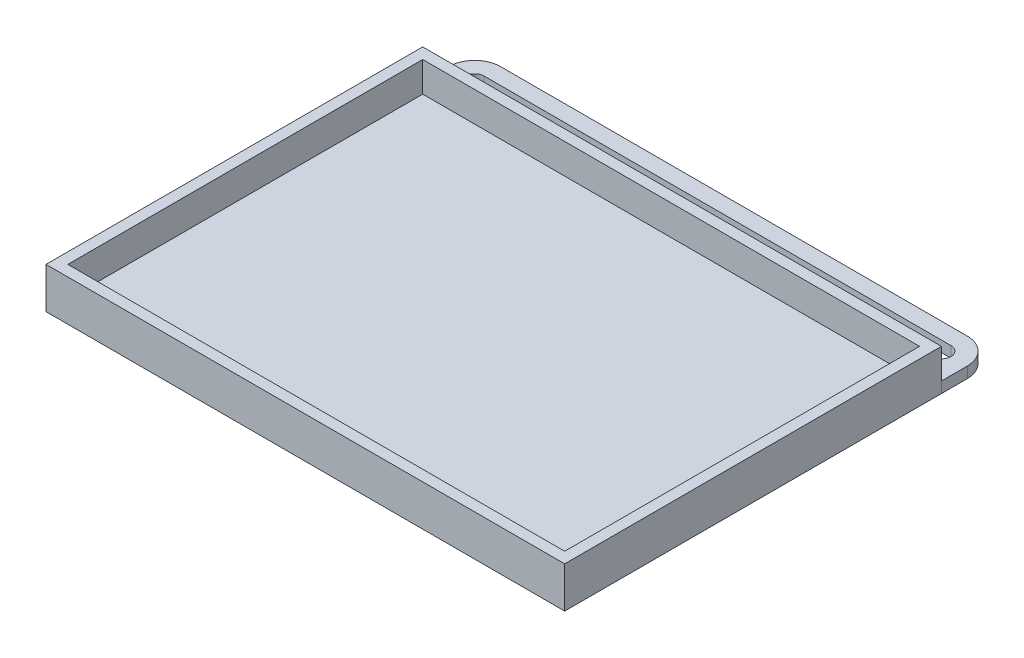
ISO-10303-21;
HEADER;
FILE_DESCRIPTION(('STEP AP214'),'2;1');
FILE_NAME('part.step','',(''),(''),'','','');
FILE_SCHEMA(('AUTOMOTIVE_DESIGN { 1 0 10303 214 1 1 1 1 }'));
ENDSEC;
DATA;
#1=APPLICATION_CONTEXT('core data for automotive mechanical design processes');
#2=APPLICATION_PROTOCOL_DEFINITION('international standard','automotive_design',2000,#1);
#3=PRODUCT_CONTEXT('',#1,'mechanical');
#4=PRODUCT('Part','Part','',(#3));
#5=PRODUCT_RELATED_PRODUCT_CATEGORY('part','',(#4));
#6=PRODUCT_DEFINITION_FORMATION('','',#4);
#7=PRODUCT_DEFINITION_CONTEXT('part definition',#1,'design');
#8=PRODUCT_DEFINITION('design','',#6,#7);
#9=PRODUCT_DEFINITION_SHAPE('','',#8);
#10=(LENGTH_UNIT() NAMED_UNIT(*) SI_UNIT(.MILLI.,.METRE.));
#11=(NAMED_UNIT(*) PLANE_ANGLE_UNIT() SI_UNIT($,.RADIAN.));
#12=(NAMED_UNIT(*) SI_UNIT($,.STERADIAN.) SOLID_ANGLE_UNIT());
#13=UNCERTAINTY_MEASURE_WITH_UNIT(LENGTH_MEASURE(1.E-05),#10,'distance_accuracy_value','');
#14=(GEOMETRIC_REPRESENTATION_CONTEXT(3) GLOBAL_UNCERTAINTY_ASSIGNED_CONTEXT((#13)) GLOBAL_UNIT_ASSIGNED_CONTEXT((#10,
#11,#12)) REPRESENTATION_CONTEXT('',''));
#15=CARTESIAN_POINT('',(0.,0.,0.));
#16=DIRECTION('',(0.,0.,1.));
#17=DIRECTION('',(1.,0.,0.));
#18=AXIS2_PLACEMENT_3D('',#15,#16,#17);
#19=CARTESIAN_POINT('',(0.,0.,-76.5));
#20=DIRECTION('',(0.,0.,1.));
#21=DIRECTION('',(1.,0.,0.));
#22=AXIS2_PLACEMENT_3D('',#19,#20,#21);
#23=PLANE('',#22);
#24=DIRECTION('',(1.,0.,0.));
#25=VECTOR('',#24,1.);
#26=CARTESIAN_POINT('',(0.,2.,-76.5));
#27=LINE('',#26,#25);
#28=CARTESIAN_POINT('',(2.75,2.,-76.5));
#29=VERTEX_POINT('',#28);
#30=CARTESIAN_POINT('',(88.25,2.,-76.5));
#31=VERTEX_POINT('',#30);
#32=EDGE_CURVE('E171',#29,#31,#27,.T.);
#33=ORIENTED_EDGE('',*,*,#32,.T.);
#34=DIRECTION('',(0.,1.,0.));
#35=VECTOR('',#34,1.);
#36=CARTESIAN_POINT('',(88.25,0.,-76.5));
#37=LINE('',#36,#35);
#38=CARTESIAN_POINT('',(88.25,0.,-76.5));
#39=VERTEX_POINT('',#38);
#40=EDGE_CURVE('E12',#39,#31,#37,.T.);
#41=ORIENTED_EDGE('',*,*,#40,.F.);
#42=DIRECTION('',(1.,0.,0.));
#43=VECTOR('',#42,1.);
#44=CARTESIAN_POINT('',(0.,0.,-76.5));
#45=LINE('',#44,#43);
#46=CARTESIAN_POINT('',(2.75,0.,-76.5));
#47=VERTEX_POINT('',#46);
#48=EDGE_CURVE('E70',#47,#39,#45,.T.);
#49=ORIENTED_EDGE('',*,*,#48,.F.);
#50=DIRECTION('',(0.,1.,0.));
#51=VECTOR('',#50,1.);
#52=CARTESIAN_POINT('',(2.75,0.,-76.5));
#53=LINE('',#52,#51);
#54=EDGE_CURVE('E190',#47,#29,#53,.T.);
#55=ORIENTED_EDGE('',*,*,#54,.T.);
#56=EDGE_LOOP('',(#33,#41,#49,#55));
#57=FACE_BOUND('',#56,.T.);
#58=ADVANCED_FACE('F51',(#57),#23,.F.);
#59=CARTESIAN_POINT('',(88.25,0.,-71.75));
#60=DIRECTION('',(0.,1.,0.));
#61=DIRECTION('',(0.,0.,1.));
#62=AXIS2_PLACEMENT_3D('',#59,#60,#61);
#63=CYLINDRICAL_SURFACE('',#62,4.75);
#64=CARTESIAN_POINT('',(88.25,2.,-71.75));
#65=DIRECTION('',(0.,1.,0.));
#66=DIRECTION('',(0.,0.,1.));
#67=AXIS2_PLACEMENT_3D('',#64,#65,#66);
#68=CIRCLE('',#67,4.75);
#69=CARTESIAN_POINT('',(93.,2.,-71.75));
#70=VERTEX_POINT('',#69);
#71=EDGE_CURVE('E182',#70,#31,#68,.T.);
#72=ORIENTED_EDGE('',*,*,#71,.F.);
#73=DIRECTION('',(0.,1.,0.));
#74=VECTOR('',#73,1.);
#75=CARTESIAN_POINT('',(93.,0.,-71.75));
#76=LINE('',#75,#74);
#77=CARTESIAN_POINT('',(93.,0.,-71.75));
#78=VERTEX_POINT('',#77);
#79=EDGE_CURVE('E61',#78,#70,#76,.T.);
#80=ORIENTED_EDGE('',*,*,#79,.F.);
#81=CARTESIAN_POINT('',(88.25,0.,-71.75));
#82=DIRECTION('',(0.,1.,0.));
#83=DIRECTION('',(0.,0.,1.));
#84=AXIS2_PLACEMENT_3D('',#81,#82,#83);
#85=CIRCLE('',#84,4.75);
#86=EDGE_CURVE('E150',#78,#39,#85,.T.);
#87=ORIENTED_EDGE('',*,*,#86,.T.);
#88=ORIENTED_EDGE('',*,*,#40,.T.);
#89=EDGE_LOOP('',(#72,#80,#87,#88));
#90=FACE_BOUND('',#89,.T.);
#91=ADVANCED_FACE('F231',(#90),#63,.T.);
#92=CARTESIAN_POINT('',(93.0000000000002,0.,-2.71712477079315E-13));
#93=DIRECTION('',(1.,0.,0.));
#94=DIRECTION('',(0.,0.,-1.));
#95=AXIS2_PLACEMENT_3D('',#92,#93,#94);
#96=PLANE('',#95);
#97=DIRECTION('',(0.,0.,-1.));
#98=VECTOR('',#97,1.);
#99=CARTESIAN_POINT('',(93.0000000000002,2.,-2.71712477079315E-13));
#100=LINE('',#99,#98);
#101=CARTESIAN_POINT('',(93.,2.,-67.));
#102=VERTEX_POINT('',#101);
#103=EDGE_CURVE('E140',#102,#70,#100,.T.);
#104=ORIENTED_EDGE('',*,*,#103,.F.);
#105=DIRECTION('',(0.,1.,0.));
#106=VECTOR('',#105,1.);
#107=CARTESIAN_POINT('',(93.,0.,-67.));
#108=LINE('',#107,#106);
#109=CARTESIAN_POINT('',(93.,0.,-67.));
#110=VERTEX_POINT('',#109);
#111=EDGE_CURVE('E136',#110,#102,#108,.T.);
#112=ORIENTED_EDGE('',*,*,#111,.F.);
#113=DIRECTION('',(0.,0.,-1.));
#114=VECTOR('',#113,1.);
#115=CARTESIAN_POINT('',(93.0000000000002,0.,-2.71712477079315E-13));
#116=LINE('',#115,#114);
#117=EDGE_CURVE('E139',#110,#78,#116,.T.);
#118=ORIENTED_EDGE('',*,*,#117,.T.);
#119=ORIENTED_EDGE('',*,*,#79,.T.);
#120=EDGE_LOOP('',(#104,#112,#118,#119));
#121=FACE_BOUND('',#120,.T.);
#122=ADVANCED_FACE('F138',(#121),#96,.T.);
#123=CARTESIAN_POINT('',(0.,0.,-67.));
#124=DIRECTION('',(0.,0.,1.));
#125=DIRECTION('',(1.,0.,0.));
#126=AXIS2_PLACEMENT_3D('',#123,#124,#125);
#127=PLANE('',#126);
#128=DIRECTION('',(1.,0.,0.));
#129=VECTOR('',#128,1.);
#130=CARTESIAN_POINT('',(0.,2.,-67.));
#131=LINE('',#130,#129);
#132=CARTESIAN_POINT('',(-2.,2.,-67.));
#133=VERTEX_POINT('',#132);
#134=EDGE_CURVE('E179',#133,#102,#131,.T.);
#135=ORIENTED_EDGE('',*,*,#134,.F.);
#136=DIRECTION('',(0.,1.,0.));
#137=VECTOR('',#136,1.);
#138=CARTESIAN_POINT('',(-2.,0.,-67.));
#139=LINE('',#138,#137);
#140=CARTESIAN_POINT('',(-2.,0.,-67.));
#141=VERTEX_POINT('',#140);
#142=EDGE_CURVE('E145',#141,#133,#139,.T.);
#143=ORIENTED_EDGE('',*,*,#142,.F.);
#144=DIRECTION('',(1.,0.,0.));
#145=VECTOR('',#144,1.);
#146=CARTESIAN_POINT('',(0.,0.,-67.));
#147=LINE('',#146,#145);
#148=EDGE_CURVE('E149',#141,#110,#147,.T.);
#149=ORIENTED_EDGE('',*,*,#148,.T.);
#150=ORIENTED_EDGE('',*,*,#111,.T.);
#151=EDGE_LOOP('',(#135,#143,#149,#150));
#152=FACE_BOUND('',#151,.T.);
#153=ADVANCED_FACE('F152',(#152),#127,.T.);
#154=CARTESIAN_POINT('',(-2.,0.,0.));
#155=DIRECTION('',(1.,0.,0.));
#156=DIRECTION('',(0.,0.,-1.));
#157=AXIS2_PLACEMENT_3D('',#154,#155,#156);
#158=PLANE('',#157);
#159=DIRECTION('',(0.,0.,-1.));
#160=VECTOR('',#159,1.);
#161=CARTESIAN_POINT('',(-2.,2.,0.));
#162=LINE('',#161,#160);
#163=CARTESIAN_POINT('',(-2.,2.,-71.75));
#164=VERTEX_POINT('',#163);
#165=EDGE_CURVE('E176',#133,#164,#162,.T.);
#166=ORIENTED_EDGE('',*,*,#165,.T.);
#167=DIRECTION('',(0.,1.,0.));
#168=VECTOR('',#167,1.);
#169=CARTESIAN_POINT('',(-2.,0.,-71.75));
#170=LINE('',#169,#168);
#171=CARTESIAN_POINT('',(-2.,0.,-71.75));
#172=VERTEX_POINT('',#171);
#173=EDGE_CURVE('E188',#172,#164,#170,.T.);
#174=ORIENTED_EDGE('',*,*,#173,.F.);
#175=DIRECTION('',(0.,0.,-1.));
#176=VECTOR('',#175,1.);
#177=CARTESIAN_POINT('',(-2.,0.,0.));
#178=LINE('',#177,#176);
#179=EDGE_CURVE('E154',#141,#172,#178,.T.);
#180=ORIENTED_EDGE('',*,*,#179,.F.);
#181=ORIENTED_EDGE('',*,*,#142,.T.);
#182=EDGE_LOOP('',(#166,#174,#180,#181));
#183=FACE_BOUND('',#182,.T.);
#184=ADVANCED_FACE('F227',(#183),#158,.F.);
#185=CARTESIAN_POINT('',(88.25,0.,-71.75));
#186=DIRECTION('',(0.,1.,0.));
#187=DIRECTION('',(0.,0.,1.));
#188=AXIS2_PLACEMENT_3D('',#185,#186,#187);
#189=CYLINDRICAL_SURFACE('',#188,1.75);
#190=CARTESIAN_POINT('',(88.25,2.,-71.75));
#191=DIRECTION('',(0.,1.,0.));
#192=DIRECTION('',(0.,0.,1.));
#193=AXIS2_PLACEMENT_3D('',#190,#191,#192);
#194=CIRCLE('',#193,1.75);
#195=CARTESIAN_POINT('',(88.25,2.,-70.));
#196=VERTEX_POINT('',#195);
#197=CARTESIAN_POINT('',(88.25,2.,-73.5));
#198=VERTEX_POINT('',#197);
#199=EDGE_CURVE('E161',#196,#198,#194,.T.);
#200=ORIENTED_EDGE('',*,*,#199,.T.);
#201=DIRECTION('',(0.,1.,0.));
#202=VECTOR('',#201,1.);
#203=CARTESIAN_POINT('',(88.25,0.,-73.5));
#204=LINE('',#203,#202);
#205=CARTESIAN_POINT('',(88.25,0.,-73.5));
#206=VERTEX_POINT('',#205);
#207=EDGE_CURVE('E192',#206,#198,#204,.T.);
#208=ORIENTED_EDGE('',*,*,#207,.F.);
#209=CARTESIAN_POINT('',(88.25,0.,-71.75));
#210=DIRECTION('',(0.,1.,0.));
#211=DIRECTION('',(0.,0.,1.));
#212=AXIS2_PLACEMENT_3D('',#209,#210,#211);
#213=CIRCLE('',#212,1.75);
#214=CARTESIAN_POINT('',(88.25,0.,-70.));
#215=VERTEX_POINT('',#214);
#216=EDGE_CURVE('E184',#215,#206,#213,.T.);
#217=ORIENTED_EDGE('',*,*,#216,.F.);
#218=DIRECTION('',(0.,1.,0.));
#219=VECTOR('',#218,1.);
#220=CARTESIAN_POINT('',(88.25,0.,-70.));
#221=LINE('',#220,#219);
#222=EDGE_CURVE('E55',#215,#196,#221,.T.);
#223=ORIENTED_EDGE('',*,*,#222,.T.);
#224=EDGE_LOOP('',(#200,#208,#217,#223));
#225=FACE_BOUND('',#224,.T.);
#226=ADVANCED_FACE('F53',(#225),#189,.F.);
#227=CARTESIAN_POINT('',(0.,0.,-73.5));
#228=DIRECTION('',(0.,0.,1.));
#229=DIRECTION('',(1.,0.,0.));
#230=AXIS2_PLACEMENT_3D('',#227,#228,#229);
#231=PLANE('',#230);
#232=DIRECTION('',(1.,0.,0.));
#233=VECTOR('',#232,1.);
#234=CARTESIAN_POINT('',(0.,2.,-73.5));
#235=LINE('',#234,#233);
#236=CARTESIAN_POINT('',(2.75,2.,-73.5));
#237=VERTEX_POINT('',#236);
#238=EDGE_CURVE('E168',#237,#198,#235,.T.);
#239=ORIENTED_EDGE('',*,*,#238,.F.);
#240=DIRECTION('',(0.,1.,0.));
#241=VECTOR('',#240,1.);
#242=CARTESIAN_POINT('',(2.75,0.,-73.5));
#243=LINE('',#242,#241);
#244=CARTESIAN_POINT('',(2.75,0.,-73.5));
#245=VERTEX_POINT('',#244);
#246=EDGE_CURVE('E194',#245,#237,#243,.T.);
#247=ORIENTED_EDGE('',*,*,#246,.F.);
#248=DIRECTION('',(1.,0.,0.));
#249=VECTOR('',#248,1.);
#250=CARTESIAN_POINT('',(0.,0.,-73.5));
#251=LINE('',#250,#249);
#252=EDGE_CURVE('E215',#245,#206,#251,.T.);
#253=ORIENTED_EDGE('',*,*,#252,.T.);
#254=ORIENTED_EDGE('',*,*,#207,.T.);
#255=EDGE_LOOP('',(#239,#247,#253,#254));
#256=FACE_BOUND('',#255,.T.);
#257=ADVANCED_FACE('F211',(#256),#231,.T.);
#258=CARTESIAN_POINT('',(2.75,0.,-71.75));
#259=DIRECTION('',(0.,1.,0.));
#260=DIRECTION('',(0.,0.,1.));
#261=AXIS2_PLACEMENT_3D('',#258,#259,#260);
#262=CYLINDRICAL_SURFACE('',#261,1.75);
#263=CARTESIAN_POINT('',(2.75,2.,-71.75));
#264=DIRECTION('',(0.,1.,0.));
#265=DIRECTION('',(0.,0.,1.));
#266=AXIS2_PLACEMENT_3D('',#263,#264,#265);
#267=CIRCLE('',#266,1.75);
#268=CARTESIAN_POINT('',(2.75,2.,-70.));
#269=VERTEX_POINT('',#268);
#270=EDGE_CURVE('E166',#237,#269,#267,.T.);
#271=ORIENTED_EDGE('',*,*,#270,.T.);
#272=DIRECTION('',(0.,1.,0.));
#273=VECTOR('',#272,1.);
#274=CARTESIAN_POINT('',(2.75,0.,-70.));
#275=LINE('',#274,#273);
#276=CARTESIAN_POINT('',(2.75,0.,-70.));
#277=VERTEX_POINT('',#276);
#278=EDGE_CURVE('E195',#277,#269,#275,.T.);
#279=ORIENTED_EDGE('',*,*,#278,.F.);
#280=CARTESIAN_POINT('',(2.75,0.,-71.75));
#281=DIRECTION('',(0.,1.,0.));
#282=DIRECTION('',(0.,0.,1.));
#283=AXIS2_PLACEMENT_3D('',#280,#281,#282);
#284=CIRCLE('',#283,1.75);
#285=EDGE_CURVE('E216',#245,#277,#284,.T.);
#286=ORIENTED_EDGE('',*,*,#285,.F.);
#287=ORIENTED_EDGE('',*,*,#246,.T.);
#288=EDGE_LOOP('',(#271,#279,#286,#287));
#289=FACE_BOUND('',#288,.T.);
#290=ADVANCED_FACE('F252',(#289),#262,.F.);
#291=CARTESIAN_POINT('',(0.,0.,-70.));
#292=DIRECTION('',(0.,0.,1.));
#293=DIRECTION('',(1.,0.,0.));
#294=AXIS2_PLACEMENT_3D('',#291,#292,#293);
#295=PLANE('',#294);
#296=DIRECTION('',(1.,0.,0.));
#297=VECTOR('',#296,1.);
#298=CARTESIAN_POINT('',(0.,2.,-70.));
#299=LINE('',#298,#297);
#300=EDGE_CURVE('E164',#269,#196,#299,.T.);
#301=ORIENTED_EDGE('',*,*,#300,.T.);
#302=ORIENTED_EDGE('',*,*,#222,.F.);
#303=DIRECTION('',(1.,0.,0.));
#304=VECTOR('',#303,1.);
#305=CARTESIAN_POINT('',(0.,0.,-70.));
#306=LINE('',#305,#304);
#307=EDGE_CURVE('E118',#277,#215,#306,.T.);
#308=ORIENTED_EDGE('',*,*,#307,.F.);
#309=ORIENTED_EDGE('',*,*,#278,.T.);
#310=EDGE_LOOP('',(#301,#302,#308,#309));
#311=FACE_BOUND('',#310,.T.);
#312=ADVANCED_FACE('F248',(#311),#295,.F.);
#313=CARTESIAN_POINT('',(2.75,0.,-71.75));
#314=DIRECTION('',(0.,1.,0.));
#315=DIRECTION('',(0.,0.,1.));
#316=AXIS2_PLACEMENT_3D('',#313,#314,#315);
#317=CYLINDRICAL_SURFACE('',#316,4.75);
#318=CARTESIAN_POINT('',(2.75,2.,-71.75));
#319=DIRECTION('',(0.,1.,0.));
#320=DIRECTION('',(0.,0.,1.));
#321=AXIS2_PLACEMENT_3D('',#318,#319,#320);
#322=CIRCLE('',#321,4.75);
#323=EDGE_CURVE('E173',#29,#164,#322,.T.);
#324=ORIENTED_EDGE('',*,*,#323,.F.);
#325=ORIENTED_EDGE('',*,*,#54,.F.);
#326=CARTESIAN_POINT('',(2.75,0.,-71.75));
#327=DIRECTION('',(0.,1.,0.));
#328=DIRECTION('',(0.,0.,1.));
#329=AXIS2_PLACEMENT_3D('',#326,#327,#328);
#330=CIRCLE('',#329,4.75);
#331=EDGE_CURVE('E156',#47,#172,#330,.T.);
#332=ORIENTED_EDGE('',*,*,#331,.T.);
#333=ORIENTED_EDGE('',*,*,#173,.T.);
#334=EDGE_LOOP('',(#324,#325,#332,#333));
#335=FACE_BOUND('',#334,.T.);
#336=ADVANCED_FACE('F224',(#335),#317,.T.);
#337=CARTESIAN_POINT('',(0.,0.,0.));
#338=DIRECTION('',(0.,1.,0.));
#339=DIRECTION('',(0.,0.,1.));
#340=AXIS2_PLACEMENT_3D('',#337,#338,#339);
#341=PLANE('',#340);
#342=ORIENTED_EDGE('',*,*,#216,.T.);
#343=ORIENTED_EDGE('',*,*,#252,.F.);
#344=ORIENTED_EDGE('',*,*,#285,.T.);
#345=ORIENTED_EDGE('',*,*,#307,.T.);
#346=EDGE_LOOP('',(#342,#343,#344,#345));
#347=FACE_BOUND('',#346,.T.);
#348=ORIENTED_EDGE('',*,*,#48,.T.);
#349=ORIENTED_EDGE('',*,*,#86,.F.);
#350=ORIENTED_EDGE('',*,*,#117,.F.);
#351=ORIENTED_EDGE('',*,*,#148,.F.);
#352=ORIENTED_EDGE('',*,*,#179,.T.);
#353=ORIENTED_EDGE('',*,*,#331,.F.);
#354=EDGE_LOOP('',(#348,#349,#350,#351,#352,#353));
#355=FACE_BOUND('',#354,.T.);
#356=ADVANCED_FACE('F148',(#347,#355),#341,.F.);
#357=CARTESIAN_POINT('',(0.,2.,0.));
#358=DIRECTION('',(0.,1.,0.));
#359=DIRECTION('',(0.,0.,1.));
#360=AXIS2_PLACEMENT_3D('',#357,#358,#359);
#361=PLANE('',#360);
#362=ORIENTED_EDGE('',*,*,#199,.F.);
#363=ORIENTED_EDGE('',*,*,#300,.F.);
#364=ORIENTED_EDGE('',*,*,#270,.F.);
#365=ORIENTED_EDGE('',*,*,#238,.T.);
#366=EDGE_LOOP('',(#362,#363,#364,#365));
#367=FACE_BOUND('',#366,.T.);
#368=ORIENTED_EDGE('',*,*,#32,.F.);
#369=ORIENTED_EDGE('',*,*,#323,.T.);
#370=ORIENTED_EDGE('',*,*,#165,.F.);
#371=ORIENTED_EDGE('',*,*,#134,.T.);
#372=ORIENTED_EDGE('',*,*,#103,.T.);
#373=ORIENTED_EDGE('',*,*,#71,.T.);
#374=EDGE_LOOP('',(#368,#369,#370,#371,#372,#373));
#375=FACE_BOUND('',#374,.T.);
#376=ADVANCED_FACE('F206',(#367,#375),#361,.T.);
#377=CLOSED_SHELL('',(#58,#91,#122,#153,#184,#226,#257,#290,#312,#336,#356,#376));
#378=MANIFOLD_SOLID_BREP('B2',#377);
#379=CARTESIAN_POINT('',(0.,7.5,0.));
#380=DIRECTION('',(0.,1.,0.));
#381=DIRECTION('',(0.,0.,1.));
#382=AXIS2_PLACEMENT_3D('',#379,#380,#381);
#383=PLANE('',#382);
#384=DIRECTION('',(-1.,0.,0.));
#385=VECTOR('',#384,1.);
#386=CARTESIAN_POINT('',(93.,7.5,-67.));
#387=LINE('',#386,#385);
#388=CARTESIAN_POINT('',(93.,7.5,-67.));
#389=VERTEX_POINT('',#388);
#390=CARTESIAN_POINT('',(-2.,7.5,-67.));
#391=VERTEX_POINT('',#390);
#392=EDGE_CURVE('E550',#389,#391,#387,.T.);
#393=ORIENTED_EDGE('',*,*,#392,.T.);
#394=DIRECTION('',(0.,0.,1.));
#395=VECTOR('',#394,1.);
#396=CARTESIAN_POINT('',(-2.,7.5,-67.));
#397=LINE('',#396,#395);
#398=CARTESIAN_POINT('',(-1.99999999999999,7.5,2.));
#399=VERTEX_POINT('',#398);
#400=EDGE_CURVE('E553',#391,#399,#397,.T.);
#401=ORIENTED_EDGE('',*,*,#400,.T.);
#402=DIRECTION('',(1.,0.,0.));
#403=VECTOR('',#402,1.);
#404=CARTESIAN_POINT('',(-1.99999999999999,7.5,2.));
#405=LINE('',#404,#403);
#406=CARTESIAN_POINT('',(93.,7.5,1.99999999999999));
#407=VERTEX_POINT('',#406);
#408=EDGE_CURVE('E555',#399,#407,#405,.T.);
#409=ORIENTED_EDGE('',*,*,#408,.T.);
#410=DIRECTION('',(0.,0.,-1.));
#411=VECTOR('',#410,1.);
#412=CARTESIAN_POINT('',(93.,7.5,1.99999999999999));
#413=LINE('',#412,#411);
#414=EDGE_CURVE('E557',#407,#389,#413,.T.);
#415=ORIENTED_EDGE('',*,*,#414,.T.);
#416=EDGE_LOOP('',(#393,#401,#409,#415));
#417=FACE_BOUND('',#416,.T.);
#418=DIRECTION('',(1.,0.,0.));
#419=VECTOR('',#418,1.);
#420=CARTESIAN_POINT('',(0.,7.5,0.));
#421=LINE('',#420,#419);
#422=CARTESIAN_POINT('',(0.,7.5,0.));
#423=VERTEX_POINT('',#422);
#424=CARTESIAN_POINT('',(91.,7.5,0.));
#425=VERTEX_POINT('',#424);
#426=EDGE_CURVE('E532',#423,#425,#421,.T.);
#427=ORIENTED_EDGE('',*,*,#426,.F.);
#428=DIRECTION('',(0.,0.,1.));
#429=VECTOR('',#428,1.);
#430=CARTESIAN_POINT('',(0.,7.5,-65.));
#431=LINE('',#430,#429);
#432=CARTESIAN_POINT('',(0.,7.5,-65.));
#433=VERTEX_POINT('',#432);
#434=EDGE_CURVE('E520',#433,#423,#431,.T.);
#435=ORIENTED_EDGE('',*,*,#434,.F.);
#436=DIRECTION('',(-1.,0.,0.));
#437=VECTOR('',#436,1.);
#438=CARTESIAN_POINT('',(91.,7.5,-65.));
#439=LINE('',#438,#437);
#440=CARTESIAN_POINT('',(91.,7.5,-65.));
#441=VERTEX_POINT('',#440);
#442=EDGE_CURVE('E537',#441,#433,#439,.T.);
#443=ORIENTED_EDGE('',*,*,#442,.F.);
#444=DIRECTION('',(0.,0.,-1.));
#445=VECTOR('',#444,1.);
#446=CARTESIAN_POINT('',(91.,7.5,0.));
#447=LINE('',#446,#445);
#448=EDGE_CURVE('E534',#425,#441,#447,.T.);
#449=ORIENTED_EDGE('',*,*,#448,.F.);
#450=EDGE_LOOP('',(#427,#435,#443,#449));
#451=FACE_BOUND('',#450,.T.);
#452=ADVANCED_FACE('F354',(#417,#451),#383,.T.);
#453=CARTESIAN_POINT('',(93.,7.5,-67.));
#454=DIRECTION('',(0.,0.,1.));
#455=DIRECTION('',(1.,0.,0.));
#456=AXIS2_PLACEMENT_3D('',#453,#454,#455);
#457=PLANE('',#456);
#458=DIRECTION('',(0.,-1.,0.));
#459=VECTOR('',#458,1.);
#460=CARTESIAN_POINT('',(93.,7.5,-67.));
#461=LINE('',#460,#459);
#462=CARTESIAN_POINT('',(93.,0.,-67.));
#463=VERTEX_POINT('',#462);
#464=EDGE_CURVE('E559',#389,#463,#461,.T.);
#465=ORIENTED_EDGE('',*,*,#464,.T.);
#466=DIRECTION('',(1.,0.,0.));
#467=VECTOR('',#466,1.);
#468=CARTESIAN_POINT('',(93.,0.,-67.));
#469=LINE('',#468,#467);
#470=CARTESIAN_POINT('',(-2.,0.,-67.));
#471=VERTEX_POINT('',#470);
#472=EDGE_CURVE('E521',#471,#463,#469,.T.);
#473=ORIENTED_EDGE('',*,*,#472,.F.);
#474=DIRECTION('',(0.,-1.,0.));
#475=VECTOR('',#474,1.);
#476=CARTESIAN_POINT('',(-2.,7.5,-67.));
#477=LINE('',#476,#475);
#478=EDGE_CURVE('E49',#391,#471,#477,.T.);
#479=ORIENTED_EDGE('',*,*,#478,.F.);
#480=ORIENTED_EDGE('',*,*,#392,.F.);
#481=EDGE_LOOP('',(#465,#473,#479,#480));
#482=FACE_BOUND('',#481,.T.);
#483=ADVANCED_FACE('F356',(#482),#457,.F.);
#484=CARTESIAN_POINT('',(-2.,7.5,-67.));
#485=DIRECTION('',(1.,0.,0.));
#486=DIRECTION('',(0.,0.,-1.));
#487=AXIS2_PLACEMENT_3D('',#484,#485,#486);
#488=PLANE('',#487);
#489=ORIENTED_EDGE('',*,*,#478,.T.);
#490=DIRECTION('',(0.,0.,-1.));
#491=VECTOR('',#490,1.);
#492=CARTESIAN_POINT('',(-2.,0.,-67.));
#493=LINE('',#492,#491);
#494=CARTESIAN_POINT('',(-1.99999999999999,0.,2.));
#495=VERTEX_POINT('',#494);
#496=EDGE_CURVE('E517',#495,#471,#493,.T.);
#497=ORIENTED_EDGE('',*,*,#496,.F.);
#498=DIRECTION('',(0.,-1.,0.));
#499=VECTOR('',#498,1.);
#500=CARTESIAN_POINT('',(-1.99999999999999,7.5,2.));
#501=LINE('',#500,#499);
#502=EDGE_CURVE('E362',#399,#495,#501,.T.);
#503=ORIENTED_EDGE('',*,*,#502,.F.);
#504=ORIENTED_EDGE('',*,*,#400,.F.);
#505=EDGE_LOOP('',(#489,#497,#503,#504));
#506=FACE_BOUND('',#505,.T.);
#507=ADVANCED_FACE('F572',(#506),#488,.F.);
#508=CARTESIAN_POINT('',(-1.99999999999999,7.5,2.));
#509=DIRECTION('',(0.,0.,-1.));
#510=DIRECTION('',(-1.,0.,0.));
#511=AXIS2_PLACEMENT_3D('',#508,#509,#510);
#512=PLANE('',#511);
#513=ORIENTED_EDGE('',*,*,#502,.T.);
#514=DIRECTION('',(-1.,0.,0.));
#515=VECTOR('',#514,1.);
#516=CARTESIAN_POINT('',(-1.99999999999999,0.,2.));
#517=LINE('',#516,#515);
#518=CARTESIAN_POINT('',(93.,0.,1.99999999999999));
#519=VERTEX_POINT('',#518);
#520=EDGE_CURVE('E522',#519,#495,#517,.T.);
#521=ORIENTED_EDGE('',*,*,#520,.F.);
#522=DIRECTION('',(0.,-1.,0.));
#523=VECTOR('',#522,1.);
#524=CARTESIAN_POINT('',(93.,7.5,1.99999999999999));
#525=LINE('',#524,#523);
#526=EDGE_CURVE('E561',#407,#519,#525,.T.);
#527=ORIENTED_EDGE('',*,*,#526,.F.);
#528=ORIENTED_EDGE('',*,*,#408,.F.);
#529=EDGE_LOOP('',(#513,#521,#527,#528));
#530=FACE_BOUND('',#529,.T.);
#531=ADVANCED_FACE('F566',(#530),#512,.F.);
#532=CARTESIAN_POINT('',(93.,7.5,1.99999999999999));
#533=DIRECTION('',(-1.,0.,0.));
#534=DIRECTION('',(0.,0.,1.));
#535=AXIS2_PLACEMENT_3D('',#532,#533,#534);
#536=PLANE('',#535);
#537=ORIENTED_EDGE('',*,*,#526,.T.);
#538=DIRECTION('',(0.,0.,1.));
#539=VECTOR('',#538,1.);
#540=CARTESIAN_POINT('',(93.,0.,1.99999999999999));
#541=LINE('',#540,#539);
#542=EDGE_CURVE('E525',#463,#519,#541,.T.);
#543=ORIENTED_EDGE('',*,*,#542,.F.);
#544=ORIENTED_EDGE('',*,*,#464,.F.);
#545=ORIENTED_EDGE('',*,*,#414,.F.);
#546=EDGE_LOOP('',(#537,#543,#544,#545));
#547=FACE_BOUND('',#546,.T.);
#548=ADVANCED_FACE('F578',(#547),#536,.F.);
#549=CARTESIAN_POINT('',(0.,7.5,-65.));
#550=DIRECTION('',(1.,0.,0.));
#551=DIRECTION('',(0.,0.,-1.));
#552=AXIS2_PLACEMENT_3D('',#549,#550,#551);
#553=PLANE('',#552);
#554=DIRECTION('',(0.,0.,-1.));
#555=VECTOR('',#554,1.);
#556=CARTESIAN_POINT('',(0.,2.,0.));
#557=LINE('',#556,#555);
#558=CARTESIAN_POINT('',(0.,2.,0.));
#559=VERTEX_POINT('',#558);
#560=CARTESIAN_POINT('',(0.,2.,-65.));
#561=VERTEX_POINT('',#560);
#562=EDGE_CURVE('E514',#559,#561,#557,.T.);
#563=ORIENTED_EDGE('',*,*,#562,.T.);
#564=DIRECTION('',(0.,-1.,0.));
#565=VECTOR('',#564,1.);
#566=CARTESIAN_POINT('',(0.,7.5,-65.));
#567=LINE('',#566,#565);
#568=EDGE_CURVE('E539',#433,#561,#567,.T.);
#569=ORIENTED_EDGE('',*,*,#568,.F.);
#570=ORIENTED_EDGE('',*,*,#434,.T.);
#571=DIRECTION('',(0.,-1.,0.));
#572=VECTOR('',#571,1.);
#573=CARTESIAN_POINT('',(0.,7.5,0.));
#574=LINE('',#573,#572);
#575=EDGE_CURVE('E547',#423,#559,#574,.T.);
#576=ORIENTED_EDGE('',*,*,#575,.T.);
#577=EDGE_LOOP('',(#563,#569,#570,#576));
#578=FACE_BOUND('',#577,.T.);
#579=ADVANCED_FACE('F606',(#578),#553,.T.);
#580=CARTESIAN_POINT('',(0.,7.5,0.));
#581=DIRECTION('',(0.,0.,-1.));
#582=DIRECTION('',(-1.,0.,0.));
#583=AXIS2_PLACEMENT_3D('',#580,#581,#582);
#584=PLANE('',#583);
#585=DIRECTION('',(1.,0.,0.));
#586=VECTOR('',#585,1.);
#587=CARTESIAN_POINT('',(0.,2.,0.));
#588=LINE('',#587,#586);
#589=CARTESIAN_POINT('',(25.5,2.,0.));
#590=VERTEX_POINT('',#589);
#591=EDGE_CURVE('E506',#559,#590,#588,.T.);
#592=ORIENTED_EDGE('',*,*,#591,.F.);
#593=ORIENTED_EDGE('',*,*,#575,.F.);
#594=ORIENTED_EDGE('',*,*,#426,.T.);
#595=DIRECTION('',(0.,-1.,0.));
#596=VECTOR('',#595,1.);
#597=CARTESIAN_POINT('',(91.,7.5,0.));
#598=LINE('',#597,#596);
#599=CARTESIAN_POINT('',(91.,2.,0.));
#600=VERTEX_POINT('',#599);
#601=EDGE_CURVE('E545',#425,#600,#598,.T.);
#602=ORIENTED_EDGE('',*,*,#601,.T.);
#603=CARTESIAN_POINT('',(65.5,2.,0.));
#604=VERTEX_POINT('',#603);
#605=EDGE_CURVE('E376',#604,#600,#588,.T.);
#606=ORIENTED_EDGE('',*,*,#605,.F.);
#607=DIRECTION('',(0.,1.,0.));
#608=VECTOR('',#607,1.);
#609=CARTESIAN_POINT('',(65.5,0.,0.));
#610=LINE('',#609,#608);
#611=CARTESIAN_POINT('',(65.5,0.,0.));
#612=VERTEX_POINT('',#611);
#613=EDGE_CURVE('E503',#612,#604,#610,.T.);
#614=ORIENTED_EDGE('',*,*,#613,.F.);
#615=DIRECTION('',(-1.,0.,0.));
#616=VECTOR('',#615,1.);
#617=CARTESIAN_POINT('',(0.,0.,0.));
#618=LINE('',#617,#616);
#619=CARTESIAN_POINT('',(25.5,0.,0.));
#620=VERTEX_POINT('',#619);
#621=EDGE_CURVE('E516',#612,#620,#618,.T.);
#622=ORIENTED_EDGE('',*,*,#621,.T.);
#623=DIRECTION('',(0.,1.,0.));
#624=VECTOR('',#623,1.);
#625=CARTESIAN_POINT('',(25.5,0.,0.));
#626=LINE('',#625,#624);
#627=EDGE_CURVE('E369',#620,#590,#626,.T.);
#628=ORIENTED_EDGE('',*,*,#627,.T.);
#629=EDGE_LOOP('',(#592,#593,#594,#602,#606,#614,#622,#628));
#630=FACE_BOUND('',#629,.T.);
#631=ADVANCED_FACE('F590',(#630),#584,.T.);
#632=CARTESIAN_POINT('',(91.,7.5,0.));
#633=DIRECTION('',(-1.,0.,0.));
#634=DIRECTION('',(0.,0.,1.));
#635=AXIS2_PLACEMENT_3D('',#632,#633,#634);
#636=PLANE('',#635);
#637=DIRECTION('',(0.,0.,-1.));
#638=VECTOR('',#637,1.);
#639=CARTESIAN_POINT('',(91.,2.,0.));
#640=LINE('',#639,#638);
#641=CARTESIAN_POINT('',(91.,2.,-65.));
#642=VERTEX_POINT('',#641);
#643=EDGE_CURVE('E509',#600,#642,#640,.T.);
#644=ORIENTED_EDGE('',*,*,#643,.F.);
#645=ORIENTED_EDGE('',*,*,#601,.F.);
#646=ORIENTED_EDGE('',*,*,#448,.T.);
#647=DIRECTION('',(0.,-1.,0.));
#648=VECTOR('',#647,1.);
#649=CARTESIAN_POINT('',(91.,7.5,-65.));
#650=LINE('',#649,#648);
#651=EDGE_CURVE('E542',#441,#642,#650,.T.);
#652=ORIENTED_EDGE('',*,*,#651,.T.);
#653=EDGE_LOOP('',(#644,#645,#646,#652));
#654=FACE_BOUND('',#653,.T.);
#655=ADVANCED_FACE('F592',(#654),#636,.T.);
#656=CARTESIAN_POINT('',(91.,7.5,-65.));
#657=DIRECTION('',(0.,0.,1.));
#658=DIRECTION('',(1.,0.,0.));
#659=AXIS2_PLACEMENT_3D('',#656,#657,#658);
#660=PLANE('',#659);
#661=DIRECTION('',(1.,0.,0.));
#662=VECTOR('',#661,1.);
#663=CARTESIAN_POINT('',(0.,2.,-65.));
#664=LINE('',#663,#662);
#665=EDGE_CURVE('E512',#561,#642,#664,.T.);
#666=ORIENTED_EDGE('',*,*,#665,.T.);
#667=ORIENTED_EDGE('',*,*,#651,.F.);
#668=ORIENTED_EDGE('',*,*,#442,.T.);
#669=ORIENTED_EDGE('',*,*,#568,.T.);
#670=EDGE_LOOP('',(#666,#667,#668,#669));
#671=FACE_BOUND('',#670,.T.);
#672=ADVANCED_FACE('F609',(#671),#660,.T.);
#673=CARTESIAN_POINT('',(0.,0.,0.));
#674=DIRECTION('',(0.,1.,0.));
#675=DIRECTION('',(0.,0.,1.));
#676=AXIS2_PLACEMENT_3D('',#673,#674,#675);
#677=PLANE('',#676);
#678=DIRECTION('',(0.,0.,1.));
#679=VECTOR('',#678,1.);
#680=CARTESIAN_POINT('',(25.5,0.,0.));
#681=LINE('',#680,#679);
#682=CARTESIAN_POINT('',(25.5,0.,-1.));
#683=VERTEX_POINT('',#682);
#684=EDGE_CURVE('E483',#683,#620,#681,.T.);
#685=ORIENTED_EDGE('',*,*,#684,.T.);
#686=ORIENTED_EDGE('',*,*,#621,.F.);
#687=DIRECTION('',(0.,0.,-1.));
#688=VECTOR('',#687,1.);
#689=CARTESIAN_POINT('',(65.5,0.,0.));
#690=LINE('',#689,#688);
#691=CARTESIAN_POINT('',(65.5,0.,-1.));
#692=VERTEX_POINT('',#691);
#693=EDGE_CURVE('E481',#612,#692,#690,.T.);
#694=ORIENTED_EDGE('',*,*,#693,.T.);
#695=CARTESIAN_POINT('',(63.5,0.,-1.));
#696=DIRECTION('',(0.,1.,0.));
#697=DIRECTION('',(0.,0.,-1.));
#698=AXIS2_PLACEMENT_3D('',#695,#696,#697);
#699=CIRCLE('',#698,2.);
#700=CARTESIAN_POINT('',(63.5,0.,-3.));
#701=VERTEX_POINT('',#700);
#702=EDGE_CURVE('E457',#692,#701,#699,.T.);
#703=ORIENTED_EDGE('',*,*,#702,.T.);
#704=DIRECTION('',(-1.,0.,0.));
#705=VECTOR('',#704,1.);
#706=CARTESIAN_POINT('',(27.5,0.,-3.));
#707=LINE('',#706,#705);
#708=CARTESIAN_POINT('',(27.5,0.,-3.));
#709=VERTEX_POINT('',#708);
#710=EDGE_CURVE('E468',#701,#709,#707,.T.);
#711=ORIENTED_EDGE('',*,*,#710,.T.);
#712=CARTESIAN_POINT('',(27.5,0.,-1.));
#713=DIRECTION('',(0.,1.,0.));
#714=DIRECTION('',(0.,0.,-1.));
#715=AXIS2_PLACEMENT_3D('',#712,#713,#714);
#716=CIRCLE('',#715,2.);
#717=EDGE_CURVE('E473',#709,#683,#716,.T.);
#718=ORIENTED_EDGE('',*,*,#717,.T.);
#719=EDGE_LOOP('',(#685,#686,#694,#703,#711,#718));
#720=FACE_BOUND('',#719,.T.);
#721=ORIENTED_EDGE('',*,*,#472,.T.);
#722=ORIENTED_EDGE('',*,*,#542,.T.);
#723=ORIENTED_EDGE('',*,*,#520,.T.);
#724=ORIENTED_EDGE('',*,*,#496,.T.);
#725=EDGE_LOOP('',(#721,#722,#723,#724));
#726=FACE_BOUND('',#725,.T.);
#727=ADVANCED_FACE('F477',(#720,#726),#677,.F.);
#728=CARTESIAN_POINT('',(0.,2.,0.));
#729=DIRECTION('',(0.,1.,0.));
#730=DIRECTION('',(0.,0.,1.));
#731=AXIS2_PLACEMENT_3D('',#728,#729,#730);
#732=PLANE('',#731);
#733=DIRECTION('',(0.,0.,1.));
#734=VECTOR('',#733,1.);
#735=CARTESIAN_POINT('',(25.5,2.,0.));
#736=LINE('',#735,#734);
#737=CARTESIAN_POINT('',(25.5,2.,-1.));
#738=VERTEX_POINT('',#737);
#739=EDGE_CURVE('E488',#738,#590,#736,.T.);
#740=ORIENTED_EDGE('',*,*,#739,.F.);
#741=CARTESIAN_POINT('',(27.5,2.,-1.));
#742=DIRECTION('',(0.,1.,0.));
#743=DIRECTION('',(0.,0.,-1.));
#744=AXIS2_PLACEMENT_3D('',#741,#742,#743);
#745=CIRCLE('',#744,2.);
#746=CARTESIAN_POINT('',(27.5,2.,-3.));
#747=VERTEX_POINT('',#746);
#748=EDGE_CURVE('E496',#747,#738,#745,.T.);
#749=ORIENTED_EDGE('',*,*,#748,.F.);
#750=DIRECTION('',(-1.,0.,0.));
#751=VECTOR('',#750,1.);
#752=CARTESIAN_POINT('',(27.5,2.,-3.));
#753=LINE('',#752,#751);
#754=CARTESIAN_POINT('',(63.5,2.,-3.));
#755=VERTEX_POINT('',#754);
#756=EDGE_CURVE('E494',#755,#747,#753,.T.);
#757=ORIENTED_EDGE('',*,*,#756,.F.);
#758=CARTESIAN_POINT('',(63.5,2.,-1.));
#759=DIRECTION('',(0.,1.,0.));
#760=DIRECTION('',(0.,0.,-1.));
#761=AXIS2_PLACEMENT_3D('',#758,#759,#760);
#762=CIRCLE('',#761,2.);
#763=CARTESIAN_POINT('',(65.5,2.,-1.));
#764=VERTEX_POINT('',#763);
#765=EDGE_CURVE('E460',#764,#755,#762,.T.);
#766=ORIENTED_EDGE('',*,*,#765,.F.);
#767=DIRECTION('',(0.,0.,-1.));
#768=VECTOR('',#767,1.);
#769=CARTESIAN_POINT('',(65.5,2.,0.));
#770=LINE('',#769,#768);
#771=EDGE_CURVE('E490',#604,#764,#770,.T.);
#772=ORIENTED_EDGE('',*,*,#771,.F.);
#773=ORIENTED_EDGE('',*,*,#605,.T.);
#774=ORIENTED_EDGE('',*,*,#643,.T.);
#775=ORIENTED_EDGE('',*,*,#665,.F.);
#776=ORIENTED_EDGE('',*,*,#562,.F.);
#777=ORIENTED_EDGE('',*,*,#591,.T.);
#778=EDGE_LOOP('',(#740,#749,#757,#766,#772,#773,#774,#775,#776,#777));
#779=FACE_BOUND('',#778,.T.);
#780=ADVANCED_FACE('F596',(#779),#732,.T.);
#781=CARTESIAN_POINT('',(25.5,0.,0.));
#782=DIRECTION('',(-1.,0.,0.));
#783=DIRECTION('',(0.,0.,1.));
#784=AXIS2_PLACEMENT_3D('',#781,#782,#783);
#785=PLANE('',#784);
#786=ORIENTED_EDGE('',*,*,#739,.T.);
#787=ORIENTED_EDGE('',*,*,#627,.F.);
#788=ORIENTED_EDGE('',*,*,#684,.F.);
#789=DIRECTION('',(0.,1.,0.));
#790=VECTOR('',#789,1.);
#791=CARTESIAN_POINT('',(25.5,0.,-1.));
#792=LINE('',#791,#790);
#793=EDGE_CURVE('E499',#683,#738,#792,.T.);
#794=ORIENTED_EDGE('',*,*,#793,.T.);
#795=EDGE_LOOP('',(#786,#787,#788,#794));
#796=FACE_BOUND('',#795,.T.);
#797=ADVANCED_FACE('F603',(#796),#785,.F.);
#798=CARTESIAN_POINT('',(27.5,0.,-1.));
#799=DIRECTION('',(0.,1.,0.));
#800=DIRECTION('',(0.,0.,1.));
#801=AXIS2_PLACEMENT_3D('',#798,#799,#800);
#802=CYLINDRICAL_SURFACE('',#801,2.);
#803=ORIENTED_EDGE('',*,*,#748,.T.);
#804=ORIENTED_EDGE('',*,*,#793,.F.);
#805=ORIENTED_EDGE('',*,*,#717,.F.);
#806=DIRECTION('',(0.,1.,0.));
#807=VECTOR('',#806,1.);
#808=CARTESIAN_POINT('',(27.5,0.,-3.));
#809=LINE('',#808,#807);
#810=EDGE_CURVE('E464',#709,#747,#809,.T.);
#811=ORIENTED_EDGE('',*,*,#810,.T.);
#812=EDGE_LOOP('',(#803,#804,#805,#811));
#813=FACE_BOUND('',#812,.T.);
#814=ADVANCED_FACE('F714',(#813),#802,.F.);
#815=CARTESIAN_POINT('',(27.5,0.,-3.));
#816=DIRECTION('',(0.,0.,-1.));
#817=DIRECTION('',(-1.,0.,0.));
#818=AXIS2_PLACEMENT_3D('',#815,#816,#817);
#819=PLANE('',#818);
#820=ORIENTED_EDGE('',*,*,#756,.T.);
#821=ORIENTED_EDGE('',*,*,#810,.F.);
#822=ORIENTED_EDGE('',*,*,#710,.F.);
#823=DIRECTION('',(0.,1.,0.));
#824=VECTOR('',#823,1.);
#825=CARTESIAN_POINT('',(63.5,0.,-3.));
#826=LINE('',#825,#824);
#827=EDGE_CURVE('E453',#701,#755,#826,.T.);
#828=ORIENTED_EDGE('',*,*,#827,.T.);
#829=EDGE_LOOP('',(#820,#821,#822,#828));
#830=FACE_BOUND('',#829,.T.);
#831=ADVANCED_FACE('F469',(#830),#819,.F.);
#832=CARTESIAN_POINT('',(63.5,0.,-1.));
#833=DIRECTION('',(0.,1.,0.));
#834=DIRECTION('',(0.,0.,1.));
#835=AXIS2_PLACEMENT_3D('',#832,#833,#834);
#836=CYLINDRICAL_SURFACE('',#835,2.);
#837=ORIENTED_EDGE('',*,*,#765,.T.);
#838=ORIENTED_EDGE('',*,*,#827,.F.);
#839=ORIENTED_EDGE('',*,*,#702,.F.);
#840=DIRECTION('',(0.,1.,0.));
#841=VECTOR('',#840,1.);
#842=CARTESIAN_POINT('',(65.5,0.,-1.));
#843=LINE('',#842,#841);
#844=EDGE_CURVE('E465',#692,#764,#843,.T.);
#845=ORIENTED_EDGE('',*,*,#844,.T.);
#846=EDGE_LOOP('',(#837,#838,#839,#845));
#847=FACE_BOUND('',#846,.T.);
#848=ADVANCED_FACE('F455',(#847),#836,.F.);
#849=CARTESIAN_POINT('',(65.5,0.,0.));
#850=DIRECTION('',(1.,0.,0.));
#851=DIRECTION('',(0.,0.,-1.));
#852=AXIS2_PLACEMENT_3D('',#849,#850,#851);
#853=PLANE('',#852);
#854=ORIENTED_EDGE('',*,*,#771,.T.);
#855=ORIENTED_EDGE('',*,*,#844,.F.);
#856=ORIENTED_EDGE('',*,*,#693,.F.);
#857=ORIENTED_EDGE('',*,*,#613,.T.);
#858=EDGE_LOOP('',(#854,#855,#856,#857));
#859=FACE_BOUND('',#858,.T.);
#860=ADVANCED_FACE('F600',(#859),#853,.F.);
#861=CLOSED_SHELL('',(#452,#483,#507,#531,#548,#579,#631,#655,#672,#727,#780,#797,#814,#831,
#848,#860));
#862=MANIFOLD_SOLID_BREP('B6',#861);
#863=ADVANCED_BREP_SHAPE_REPRESENTATION('',(#18,#378,#862),#14);
#864=SHAPE_DEFINITION_REPRESENTATION(#9,#863);
ENDSEC;
END-ISO-10303-21;
